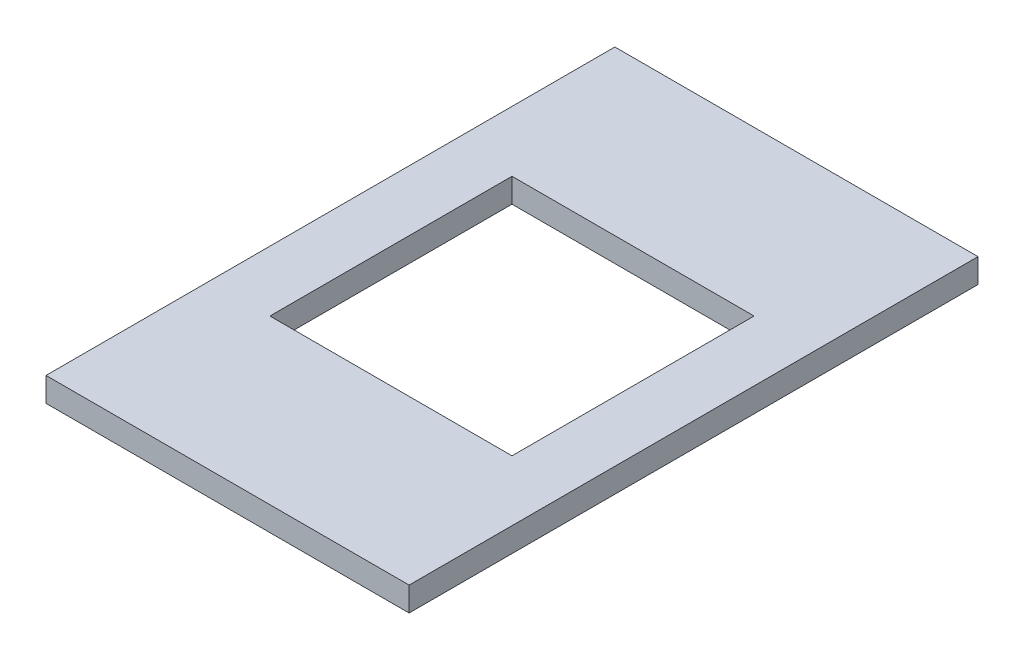
ISO-10303-21;
HEADER;
FILE_DESCRIPTION(('STEP AP214'),'2;1');
FILE_NAME('part.step','',(''),(''),'','','');
FILE_SCHEMA(('AUTOMOTIVE_DESIGN { 1 0 10303 214 1 1 1 1 }'));
ENDSEC;
DATA;
#1=APPLICATION_CONTEXT('core data for automotive mechanical design processes');
#2=APPLICATION_PROTOCOL_DEFINITION('international standard','automotive_design',2000,#1);
#3=PRODUCT_CONTEXT('',#1,'mechanical');
#4=PRODUCT('Part','Part','',(#3));
#5=PRODUCT_RELATED_PRODUCT_CATEGORY('part','',(#4));
#6=PRODUCT_DEFINITION_FORMATION('','',#4);
#7=PRODUCT_DEFINITION_CONTEXT('part definition',#1,'design');
#8=PRODUCT_DEFINITION('design','',#6,#7);
#9=PRODUCT_DEFINITION_SHAPE('','',#8);
#10=(LENGTH_UNIT() NAMED_UNIT(*) SI_UNIT(.MILLI.,.METRE.));
#11=(NAMED_UNIT(*) PLANE_ANGLE_UNIT() SI_UNIT($,.RADIAN.));
#12=(NAMED_UNIT(*) SI_UNIT($,.STERADIAN.) SOLID_ANGLE_UNIT());
#13=UNCERTAINTY_MEASURE_WITH_UNIT(LENGTH_MEASURE(1.E-05),#10,'distance_accuracy_value','');
#14=(GEOMETRIC_REPRESENTATION_CONTEXT(3) GLOBAL_UNCERTAINTY_ASSIGNED_CONTEXT((#13)) GLOBAL_UNIT_ASSIGNED_CONTEXT((#10,
#11,#12)) REPRESENTATION_CONTEXT('',''));
#15=CARTESIAN_POINT('',(0.,0.,0.));
#16=DIRECTION('',(0.,0.,1.));
#17=DIRECTION('',(1.,0.,0.));
#18=AXIS2_PLACEMENT_3D('',#15,#16,#17);
#19=CARTESIAN_POINT('',(0.,10.,0.));
#20=DIRECTION('',(-1.,0.,0.));
#21=DIRECTION('',(0.,0.,1.));
#22=AXIS2_PLACEMENT_3D('',#19,#20,#21);
#23=PLANE('',#22);
#24=DIRECTION('',(0.,0.,1.));
#25=VECTOR('',#24,1.);
#26=CARTESIAN_POINT('',(0.,0.,-132.5));
#27=LINE('',#26,#25);
#28=CARTESIAN_POINT('',(0.,0.,-132.5));
#29=VERTEX_POINT('',#28);
#30=CARTESIAN_POINT('',(0.,0.,102.5));
#31=VERTEX_POINT('',#30);
#32=EDGE_CURVE('E38',#29,#31,#27,.T.);
#33=ORIENTED_EDGE('',*,*,#32,.T.);
#34=DIRECTION('',(0.,1.,0.));
#35=VECTOR('',#34,1.);
#36=CARTESIAN_POINT('',(0.,-10.,102.5));
#37=LINE('',#36,#35);
#38=CARTESIAN_POINT('',(0.,-10.,102.5));
#39=VERTEX_POINT('',#38);
#40=EDGE_CURVE('E157',#39,#31,#37,.T.);
#41=ORIENTED_EDGE('',*,*,#40,.F.);
#42=DIRECTION('',(0.,0.,1.));
#43=VECTOR('',#42,1.);
#44=CARTESIAN_POINT('',(0.,-10.,-132.5));
#45=LINE('',#44,#43);
#46=CARTESIAN_POINT('',(0.,-10.,-132.5));
#47=VERTEX_POINT('',#46);
#48=EDGE_CURVE('E143',#47,#39,#45,.T.);
#49=ORIENTED_EDGE('',*,*,#48,.F.);
#50=DIRECTION('',(0.,1.,0.));
#51=VECTOR('',#50,1.);
#52=CARTESIAN_POINT('',(0.,-10.,-132.5));
#53=LINE('',#52,#51);
#54=EDGE_CURVE('E154',#47,#29,#53,.T.);
#55=ORIENTED_EDGE('',*,*,#54,.T.);
#56=EDGE_LOOP('',(#33,#41,#49,#55));
#57=FACE_BOUND('',#56,.T.);
#58=ADVANCED_FACE('F35',(#57),#23,.F.);
#59=CARTESIAN_POINT('',(-150.,10.,0.));
#60=DIRECTION('',(1.,0.,0.));
#61=DIRECTION('',(0.,0.,-1.));
#62=AXIS2_PLACEMENT_3D('',#59,#60,#61);
#63=PLANE('',#62);
#64=DIRECTION('',(0.,0.,-1.));
#65=VECTOR('',#64,1.);
#66=CARTESIAN_POINT('',(-150.,0.,-132.5));
#67=LINE('',#66,#65);
#68=CARTESIAN_POINT('',(-150.,0.,102.5));
#69=VERTEX_POINT('',#68);
#70=CARTESIAN_POINT('',(-150.,0.,-132.5));
#71=VERTEX_POINT('',#70);
#72=EDGE_CURVE('E118',#69,#71,#67,.T.);
#73=ORIENTED_EDGE('',*,*,#72,.T.);
#74=DIRECTION('',(0.,1.,0.));
#75=VECTOR('',#74,1.);
#76=CARTESIAN_POINT('',(-150.,-10.,-132.5));
#77=LINE('',#76,#75);
#78=CARTESIAN_POINT('',(-150.,-10.,-132.5));
#79=VERTEX_POINT('',#78);
#80=EDGE_CURVE('E131',#79,#71,#77,.T.);
#81=ORIENTED_EDGE('',*,*,#80,.F.);
#82=DIRECTION('',(0.,0.,-1.));
#83=VECTOR('',#82,1.);
#84=CARTESIAN_POINT('',(-150.,-10.,-132.5));
#85=LINE('',#84,#83);
#86=CARTESIAN_POINT('',(-150.,-10.,102.5));
#87=VERTEX_POINT('',#86);
#88=EDGE_CURVE('E137',#87,#79,#85,.T.);
#89=ORIENTED_EDGE('',*,*,#88,.F.);
#90=DIRECTION('',(0.,1.,0.));
#91=VECTOR('',#90,1.);
#92=CARTESIAN_POINT('',(-150.,-10.,102.5));
#93=LINE('',#92,#91);
#94=EDGE_CURVE('E147',#87,#69,#93,.T.);
#95=ORIENTED_EDGE('',*,*,#94,.T.);
#96=EDGE_LOOP('',(#73,#81,#89,#95));
#97=FACE_BOUND('',#96,.T.);
#98=ADVANCED_FACE('F179',(#97),#63,.F.);
#99=CARTESIAN_POINT('',(0.,0.,0.));
#100=DIRECTION('',(0.,-1.,0.));
#101=DIRECTION('',(0.,0.,-1.));
#102=AXIS2_PLACEMENT_3D('',#99,#100,#101);
#103=PLANE('',#102);
#104=DIRECTION('',(-1.,0.,0.));
#105=VECTOR('',#104,1.);
#106=CARTESIAN_POINT('',(-125.,0.,35.));
#107=LINE('',#106,#105);
#108=CARTESIAN_POINT('',(-25.,0.,35.));
#109=VERTEX_POINT('',#108);
#110=CARTESIAN_POINT('',(-125.,0.,35.));
#111=VERTEX_POINT('',#110);
#112=EDGE_CURVE('E117',#109,#111,#107,.T.);
#113=ORIENTED_EDGE('',*,*,#112,.T.);
#114=DIRECTION('',(0.,0.,-1.));
#115=VECTOR('',#114,1.);
#116=CARTESIAN_POINT('',(-125.,0.,-65.));
#117=LINE('',#116,#115);
#118=CARTESIAN_POINT('',(-125.,0.,-65.));
#119=VERTEX_POINT('',#118);
#120=EDGE_CURVE('E44',#111,#119,#117,.T.);
#121=ORIENTED_EDGE('',*,*,#120,.T.);
#122=DIRECTION('',(1.,0.,0.));
#123=VECTOR('',#122,1.);
#124=CARTESIAN_POINT('',(-125.,0.,-65.));
#125=LINE('',#124,#123);
#126=CARTESIAN_POINT('',(-25.,0.,-65.));
#127=VERTEX_POINT('',#126);
#128=EDGE_CURVE('E109',#119,#127,#125,.T.);
#129=ORIENTED_EDGE('',*,*,#128,.T.);
#130=DIRECTION('',(0.,0.,1.));
#131=VECTOR('',#130,1.);
#132=CARTESIAN_POINT('',(-25.,0.,-65.));
#133=LINE('',#132,#131);
#134=EDGE_CURVE('E11',#127,#109,#133,.T.);
#135=ORIENTED_EDGE('',*,*,#134,.T.);
#136=EDGE_LOOP('',(#113,#121,#129,#135));
#137=FACE_BOUND('',#136,.T.);
#138=DIRECTION('',(1.,0.,0.));
#139=VECTOR('',#138,1.);
#140=CARTESIAN_POINT('',(0.,0.,-132.5));
#141=LINE('',#140,#139);
#142=EDGE_CURVE('E150',#71,#29,#141,.T.);
#143=ORIENTED_EDGE('',*,*,#142,.F.);
#144=ORIENTED_EDGE('',*,*,#72,.F.);
#145=DIRECTION('',(-1.,0.,0.));
#146=VECTOR('',#145,1.);
#147=CARTESIAN_POINT('',(0.,0.,102.5));
#148=LINE('',#147,#146);
#149=EDGE_CURVE('E141',#31,#69,#148,.T.);
#150=ORIENTED_EDGE('',*,*,#149,.F.);
#151=ORIENTED_EDGE('',*,*,#32,.F.);
#152=EDGE_LOOP('',(#143,#144,#150,#151));
#153=FACE_BOUND('',#152,.T.);
#154=ADVANCED_FACE('F177',(#137,#153),#103,.F.);
#155=CARTESIAN_POINT('',(0.,-10.,0.));
#156=DIRECTION('',(0.,-1.,0.));
#157=DIRECTION('',(0.,0.,-1.));
#158=AXIS2_PLACEMENT_3D('',#155,#156,#157);
#159=PLANE('',#158);
#160=ORIENTED_EDGE('',*,*,#88,.T.);
#161=DIRECTION('',(1.,0.,0.));
#162=VECTOR('',#161,1.);
#163=CARTESIAN_POINT('',(0.,-10.,-132.5));
#164=LINE('',#163,#162);
#165=EDGE_CURVE('E140',#79,#47,#164,.T.);
#166=ORIENTED_EDGE('',*,*,#165,.T.);
#167=ORIENTED_EDGE('',*,*,#48,.T.);
#168=DIRECTION('',(-1.,0.,0.));
#169=VECTOR('',#168,1.);
#170=CARTESIAN_POINT('',(0.,-10.,102.5));
#171=LINE('',#170,#169);
#172=EDGE_CURVE('E145',#39,#87,#171,.T.);
#173=ORIENTED_EDGE('',*,*,#172,.T.);
#174=EDGE_LOOP('',(#160,#166,#167,#173));
#175=FACE_BOUND('',#174,.T.);
#176=DIRECTION('',(-1.,0.,0.));
#177=VECTOR('',#176,1.);
#178=CARTESIAN_POINT('',(-125.,-10.,35.));
#179=LINE('',#178,#177);
#180=CARTESIAN_POINT('',(-25.,-10.,35.));
#181=VERTEX_POINT('',#180);
#182=CARTESIAN_POINT('',(-125.,-10.,35.));
#183=VERTEX_POINT('',#182);
#184=EDGE_CURVE('E108',#181,#183,#179,.T.);
#185=ORIENTED_EDGE('',*,*,#184,.F.);
#186=DIRECTION('',(0.,0.,1.));
#187=VECTOR('',#186,1.);
#188=CARTESIAN_POINT('',(-25.,-10.,-65.));
#189=LINE('',#188,#187);
#190=CARTESIAN_POINT('',(-25.,-10.,-65.));
#191=VERTEX_POINT('',#190);
#192=EDGE_CURVE('E100',#191,#181,#189,.T.);
#193=ORIENTED_EDGE('',*,*,#192,.F.);
#194=DIRECTION('',(1.,0.,0.));
#195=VECTOR('',#194,1.);
#196=CARTESIAN_POINT('',(-125.,-10.,-65.));
#197=LINE('',#196,#195);
#198=CARTESIAN_POINT('',(-125.,-10.,-65.));
#199=VERTEX_POINT('',#198);
#200=EDGE_CURVE('E125',#199,#191,#197,.T.);
#201=ORIENTED_EDGE('',*,*,#200,.F.);
#202=DIRECTION('',(0.,0.,-1.));
#203=VECTOR('',#202,1.);
#204=CARTESIAN_POINT('',(-125.,-10.,-65.));
#205=LINE('',#204,#203);
#206=EDGE_CURVE('E123',#183,#199,#205,.T.);
#207=ORIENTED_EDGE('',*,*,#206,.F.);
#208=EDGE_LOOP('',(#185,#193,#201,#207));
#209=FACE_BOUND('',#208,.T.);
#210=ADVANCED_FACE('F122',(#175,#209),#159,.T.);
#211=CARTESIAN_POINT('',(0.,-10.,-132.5));
#212=DIRECTION('',(0.,0.,1.));
#213=DIRECTION('',(1.,0.,0.));
#214=AXIS2_PLACEMENT_3D('',#211,#212,#213);
#215=PLANE('',#214);
#216=ORIENTED_EDGE('',*,*,#142,.T.);
#217=ORIENTED_EDGE('',*,*,#54,.F.);
#218=ORIENTED_EDGE('',*,*,#165,.F.);
#219=ORIENTED_EDGE('',*,*,#80,.T.);
#220=EDGE_LOOP('',(#216,#217,#218,#219));
#221=FACE_BOUND('',#220,.T.);
#222=ADVANCED_FACE('F172',(#221),#215,.F.);
#223=CARTESIAN_POINT('',(0.,-10.,102.5));
#224=DIRECTION('',(0.,0.,-1.));
#225=DIRECTION('',(-1.,0.,0.));
#226=AXIS2_PLACEMENT_3D('',#223,#224,#225);
#227=PLANE('',#226);
#228=ORIENTED_EDGE('',*,*,#149,.T.);
#229=ORIENTED_EDGE('',*,*,#94,.F.);
#230=ORIENTED_EDGE('',*,*,#172,.F.);
#231=ORIENTED_EDGE('',*,*,#40,.T.);
#232=EDGE_LOOP('',(#228,#229,#230,#231));
#233=FACE_BOUND('',#232,.T.);
#234=ADVANCED_FACE('F182',(#233),#227,.F.);
#235=CARTESIAN_POINT('',(-25.,-10.,-65.));
#236=DIRECTION('',(-1.,0.,0.));
#237=DIRECTION('',(0.,0.,1.));
#238=AXIS2_PLACEMENT_3D('',#235,#236,#237);
#239=PLANE('',#238);
#240=ORIENTED_EDGE('',*,*,#134,.F.);
#241=DIRECTION('',(0.,1.,0.));
#242=VECTOR('',#241,1.);
#243=CARTESIAN_POINT('',(-25.,-10.,-65.));
#244=LINE('',#243,#242);
#245=EDGE_CURVE('E104',#191,#127,#244,.T.);
#246=ORIENTED_EDGE('',*,*,#245,.F.);
#247=ORIENTED_EDGE('',*,*,#192,.T.);
#248=DIRECTION('',(0.,1.,0.));
#249=VECTOR('',#248,1.);
#250=CARTESIAN_POINT('',(-25.,-10.,35.));
#251=LINE('',#250,#249);
#252=EDGE_CURVE('E103',#181,#109,#251,.T.);
#253=ORIENTED_EDGE('',*,*,#252,.T.);
#254=EDGE_LOOP('',(#240,#246,#247,#253));
#255=FACE_BOUND('',#254,.T.);
#256=ADVANCED_FACE('F102',(#255),#239,.T.);
#257=CARTESIAN_POINT('',(-125.,-10.,35.));
#258=DIRECTION('',(0.,0.,-1.));
#259=DIRECTION('',(-1.,0.,0.));
#260=AXIS2_PLACEMENT_3D('',#257,#258,#259);
#261=PLANE('',#260);
#262=ORIENTED_EDGE('',*,*,#112,.F.);
#263=ORIENTED_EDGE('',*,*,#252,.F.);
#264=ORIENTED_EDGE('',*,*,#184,.T.);
#265=DIRECTION('',(0.,1.,0.));
#266=VECTOR('',#265,1.);
#267=CARTESIAN_POINT('',(-125.,-10.,35.));
#268=LINE('',#267,#266);
#269=EDGE_CURVE('E119',#183,#111,#268,.T.);
#270=ORIENTED_EDGE('',*,*,#269,.T.);
#271=EDGE_LOOP('',(#262,#263,#264,#270));
#272=FACE_BOUND('',#271,.T.);
#273=ADVANCED_FACE('F113',(#272),#261,.T.);
#274=CARTESIAN_POINT('',(-125.,-10.,-65.));
#275=DIRECTION('',(1.,0.,0.));
#276=DIRECTION('',(0.,0.,-1.));
#277=AXIS2_PLACEMENT_3D('',#274,#275,#276);
#278=PLANE('',#277);
#279=ORIENTED_EDGE('',*,*,#120,.F.);
#280=ORIENTED_EDGE('',*,*,#269,.F.);
#281=ORIENTED_EDGE('',*,*,#206,.T.);
#282=DIRECTION('',(0.,1.,0.));
#283=VECTOR('',#282,1.);
#284=CARTESIAN_POINT('',(-125.,-10.,-65.));
#285=LINE('',#284,#283);
#286=EDGE_CURVE('E52',#199,#119,#285,.T.);
#287=ORIENTED_EDGE('',*,*,#286,.T.);
#288=EDGE_LOOP('',(#279,#280,#281,#287));
#289=FACE_BOUND('',#288,.T.);
#290=ADVANCED_FACE('F208',(#289),#278,.T.);
#291=CARTESIAN_POINT('',(-125.,-10.,-65.));
#292=DIRECTION('',(0.,0.,1.));
#293=DIRECTION('',(1.,0.,0.));
#294=AXIS2_PLACEMENT_3D('',#291,#292,#293);
#295=PLANE('',#294);
#296=ORIENTED_EDGE('',*,*,#128,.F.);
#297=ORIENTED_EDGE('',*,*,#286,.F.);
#298=ORIENTED_EDGE('',*,*,#200,.T.);
#299=ORIENTED_EDGE('',*,*,#245,.T.);
#300=EDGE_LOOP('',(#296,#297,#298,#299));
#301=FACE_BOUND('',#300,.T.);
#302=ADVANCED_FACE('F213',(#301),#295,.T.);
#303=CLOSED_SHELL('',(#58,#98,#154,#210,#222,#234,#256,#273,#290,#302));
#304=MANIFOLD_SOLID_BREP('B2',#303);
#305=ADVANCED_BREP_SHAPE_REPRESENTATION('',(#18,#304),#14);
#306=SHAPE_DEFINITION_REPRESENTATION(#9,#305);
ENDSEC;
END-ISO-10303-21;
